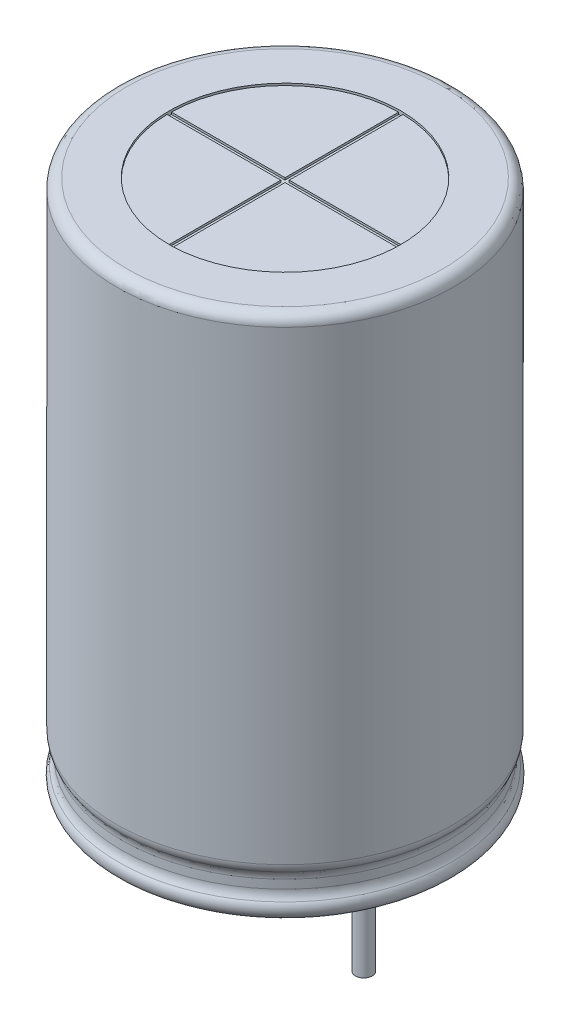
ISO-10303-21;
HEADER;
FILE_DESCRIPTION(('STEP AP214'),'2;1');
FILE_NAME('part.step','',(''),(''),'','','');
FILE_SCHEMA(('AUTOMOTIVE_DESIGN { 1 0 10303 214 1 1 1 1 }'));
ENDSEC;
DATA;
#1=APPLICATION_CONTEXT('core data for automotive mechanical design processes');
#2=APPLICATION_PROTOCOL_DEFINITION('international standard','automotive_design',2000,#1);
#3=PRODUCT_CONTEXT('',#1,'mechanical');
#4=PRODUCT('Part','Part','',(#3));
#5=PRODUCT_RELATED_PRODUCT_CATEGORY('part','',(#4));
#6=PRODUCT_DEFINITION_FORMATION('','',#4);
#7=PRODUCT_DEFINITION_CONTEXT('part definition',#1,'design');
#8=PRODUCT_DEFINITION('design','',#6,#7);
#9=PRODUCT_DEFINITION_SHAPE('','',#8);
#10=(LENGTH_UNIT() NAMED_UNIT(*) SI_UNIT(.MILLI.,.METRE.));
#11=(NAMED_UNIT(*) PLANE_ANGLE_UNIT() SI_UNIT($,.RADIAN.));
#12=(NAMED_UNIT(*) SI_UNIT($,.STERADIAN.) SOLID_ANGLE_UNIT());
#13=UNCERTAINTY_MEASURE_WITH_UNIT(LENGTH_MEASURE(1.E-05),#10,'distance_accuracy_value','');
#14=(GEOMETRIC_REPRESENTATION_CONTEXT(3) GLOBAL_UNCERTAINTY_ASSIGNED_CONTEXT((#13)) GLOBAL_UNIT_ASSIGNED_CONTEXT((#10,
#11,#12)) REPRESENTATION_CONTEXT('',''));
#15=CARTESIAN_POINT('',(0.,0.,0.));
#16=DIRECTION('',(0.,0.,1.));
#17=DIRECTION('',(1.,0.,0.));
#18=AXIS2_PLACEMENT_3D('',#15,#16,#17);
#19=CARTESIAN_POINT('',(0.,24.9,0.));
#20=DIRECTION('',(0.,-1.,0.));
#21=DIRECTION('',(0.,0.,-1.));
#22=AXIS2_PLACEMENT_3D('',#19,#20,#21);
#23=PLANE('',#22);
#24=CARTESIAN_POINT('',(0.,24.9,0.));
#25=DIRECTION('',(0.,1.,0.));
#26=DIRECTION('',(0.,0.,-1.));
#27=AXIS2_PLACEMENT_3D('',#24,#25,#26);
#28=CIRCLE('',#27,5.5);
#29=CARTESIAN_POINT('',(0.0999999999999808,24.9,5.499090833947));
#30=VERTEX_POINT('',#29);
#31=CARTESIAN_POINT('',(5.49909083394701,24.9,0.100000000000018));
#32=VERTEX_POINT('',#31);
#33=EDGE_CURVE('E145',#30,#32,#28,.T.);
#34=ORIENTED_EDGE('',*,*,#33,.T.);
#35=DIRECTION('',(1.,0.,0.));
#36=VECTOR('',#35,1.);
#37=CARTESIAN_POINT('',(0.100000000000001,24.9,0.0999999999999997));
#38=LINE('',#37,#36);
#39=CARTESIAN_POINT('',(0.100000000000001,24.9,0.0999999999999997));
#40=VERTEX_POINT('',#39);
#41=EDGE_CURVE('E179',#40,#32,#38,.T.);
#42=ORIENTED_EDGE('',*,*,#41,.F.);
#43=DIRECTION('',(0.,0.,-1.));
#44=VECTOR('',#43,1.);
#45=CARTESIAN_POINT('',(0.0999999999999823,24.9,5.499090833947));
#46=LINE('',#45,#44);
#47=EDGE_CURVE('E177',#30,#40,#46,.T.);
#48=ORIENTED_EDGE('',*,*,#47,.F.);
#49=EDGE_LOOP('',(#34,#42,#48));
#50=FACE_BOUND('',#49,.T.);
#51=ADVANCED_FACE('F35',(#50),#23,.F.);
#52=CARTESIAN_POINT('',(-5.499090833947,24.9,0.0999999999999632));
#53=VERTEX_POINT('',#52);
#54=CARTESIAN_POINT('',(-0.100000000000037,24.9,5.49909083394701));
#55=VERTEX_POINT('',#54);
#56=EDGE_CURVE('E204',#53,#55,#28,.T.);
#57=ORIENTED_EDGE('',*,*,#56,.T.);
#58=DIRECTION('',(0.,0.,1.));
#59=VECTOR('',#58,1.);
#60=CARTESIAN_POINT('',(-0.1,24.9,0.100000000000001));
#61=LINE('',#60,#59);
#62=CARTESIAN_POINT('',(-0.1,24.9,0.100000000000001));
#63=VERTEX_POINT('',#62);
#64=EDGE_CURVE('E174',#63,#55,#61,.T.);
#65=ORIENTED_EDGE('',*,*,#64,.F.);
#66=DIRECTION('',(1.,0.,0.));
#67=VECTOR('',#66,1.);
#68=CARTESIAN_POINT('',(-5.49909083394701,24.9,0.0999999999999631));
#69=LINE('',#68,#67);
#70=EDGE_CURVE('E171',#53,#63,#69,.T.);
#71=ORIENTED_EDGE('',*,*,#70,.F.);
#72=EDGE_LOOP('',(#57,#65,#71));
#73=FACE_BOUND('',#72,.T.);
#74=ADVANCED_FACE('F245',(#73),#23,.F.);
#75=CARTESIAN_POINT('',(-0.0999999999999423,24.9,-5.49909083394701));
#76=VERTEX_POINT('',#75);
#77=CARTESIAN_POINT('',(-5.49909083394701,24.9,-0.100000000000056));
#78=VERTEX_POINT('',#77);
#79=EDGE_CURVE('E200',#76,#78,#28,.T.);
#80=ORIENTED_EDGE('',*,*,#79,.T.);
#81=DIRECTION('',(-1.,0.,0.));
#82=VECTOR('',#81,1.);
#83=CARTESIAN_POINT('',(-0.1,24.9,-0.1));
#84=LINE('',#83,#82);
#85=CARTESIAN_POINT('',(-0.1,24.9,-0.1));
#86=VERTEX_POINT('',#85);
#87=EDGE_CURVE('E168',#86,#78,#84,.T.);
#88=ORIENTED_EDGE('',*,*,#87,.F.);
#89=DIRECTION('',(0.,0.,1.));
#90=VECTOR('',#89,1.);
#91=CARTESIAN_POINT('',(-0.0999999999999439,24.9,-5.49909083394701));
#92=LINE('',#91,#90);
#93=EDGE_CURVE('E165',#76,#86,#92,.T.);
#94=ORIENTED_EDGE('',*,*,#93,.F.);
#95=EDGE_LOOP('',(#80,#88,#94));
#96=FACE_BOUND('',#95,.T.);
#97=ADVANCED_FACE('F252',(#96),#23,.F.);
#98=CARTESIAN_POINT('',(0.,25.,0.));
#99=DIRECTION('',(0.,-1.,0.));
#100=DIRECTION('',(1.,0.,0.));
#101=AXIS2_PLACEMENT_3D('',#98,#99,#100);
#102=CYLINDRICAL_SURFACE('',#101,8.);
#103=CARTESIAN_POINT('',(0.,24.5,0.));
#104=DIRECTION('',(0.,1.,0.));
#105=DIRECTION('',(-1.,0.,0.));
#106=AXIS2_PLACEMENT_3D('',#103,#104,#105);
#107=CIRCLE('',#106,8.);
#108=CARTESIAN_POINT('',(-8.,24.5,0.));
#109=VERTEX_POINT('',#108);
#110=EDGE_CURVE('E219',#109,#109,#107,.F.);
#111=ORIENTED_EDGE('',*,*,#110,.T.);
#112=EDGE_LOOP('',(#111));
#113=FACE_BOUND('',#112,.T.);
#114=CARTESIAN_POINT('',(0.,2.40756880196224,0.));
#115=DIRECTION('',(0.,-1.,0.));
#116=DIRECTION('',(1.,0.,0.));
#117=AXIS2_PLACEMENT_3D('',#114,#115,#116);
#118=CIRCLE('',#117,8.);
#119=CARTESIAN_POINT('',(8.,2.40756880196224,0.));
#120=VERTEX_POINT('',#119);
#121=EDGE_CURVE('E203',#120,#120,#118,.T.);
#122=ORIENTED_EDGE('',*,*,#121,.F.);
#123=EDGE_LOOP('',(#122));
#124=FACE_BOUND('',#123,.T.);
#125=ADVANCED_FACE('F268',(#113,#124),#102,.T.);
#126=CARTESIAN_POINT('',(8.,25.,0.));
#127=DIRECTION('',(0.,1.,0.));
#128=DIRECTION('',(-1.,0.,0.));
#129=AXIS2_PLACEMENT_3D('',#126,#127,#128);
#130=PLANE('',#129);
#131=CARTESIAN_POINT('',(0.,25.,0.));
#132=DIRECTION('',(0.,1.,0.));
#133=DIRECTION('',(-1.,0.,0.));
#134=AXIS2_PLACEMENT_3D('',#131,#132,#133);
#135=CIRCLE('',#134,7.5);
#136=CARTESIAN_POINT('',(-7.5,25.,0.));
#137=VERTEX_POINT('',#136);
#138=EDGE_CURVE('E222',#137,#137,#135,.T.);
#139=ORIENTED_EDGE('',*,*,#138,.T.);
#140=EDGE_LOOP('',(#139));
#141=FACE_BOUND('',#140,.T.);
#142=CARTESIAN_POINT('',(0.,25.,0.));
#143=DIRECTION('',(0.,1.,0.));
#144=DIRECTION('',(0.,0.,-1.));
#145=AXIS2_PLACEMENT_3D('',#142,#143,#144);
#146=CIRCLE('',#145,5.5);
#147=CARTESIAN_POINT('',(0.,25.,-5.5));
#148=VERTEX_POINT('',#147);
#149=EDGE_CURVE('E182',#148,#148,#146,.T.);
#150=ORIENTED_EDGE('',*,*,#149,.F.);
#151=EDGE_LOOP('',(#150));
#152=FACE_BOUND('',#151,.T.);
#153=ADVANCED_FACE('F273',(#141,#152),#130,.T.);
#154=CARTESIAN_POINT('',(0.,0.,0.));
#155=DIRECTION('',(0.,-1.,0.));
#156=DIRECTION('',(1.,0.,0.));
#157=AXIS2_PLACEMENT_3D('',#154,#155,#156);
#158=PLANE('',#157);
#159=CARTESIAN_POINT('',(0.,0.,0.));
#160=DIRECTION('',(0.,-1.,0.));
#161=DIRECTION('',(1.,0.,0.));
#162=AXIS2_PLACEMENT_3D('',#159,#160,#161);
#163=CIRCLE('',#162,7.51793220524762);
#164=CARTESIAN_POINT('',(7.51793220524762,0.,0.));
#165=VERTEX_POINT('',#164);
#166=EDGE_CURVE('E43',#165,#165,#163,.T.);
#167=ORIENTED_EDGE('',*,*,#166,.T.);
#168=EDGE_LOOP('',(#167));
#169=FACE_BOUND('',#168,.T.);
#170=CARTESIAN_POINT('',(0.,0.,0.));
#171=DIRECTION('',(0.,-1.,0.));
#172=DIRECTION('',(1.,0.,0.));
#173=AXIS2_PLACEMENT_3D('',#170,#171,#172);
#174=CIRCLE('',#173,5.5);
#175=CARTESIAN_POINT('',(5.5,0.,0.));
#176=VERTEX_POINT('',#175);
#177=EDGE_CURVE('E370',#176,#176,#174,.T.);
#178=ORIENTED_EDGE('',*,*,#177,.F.);
#179=EDGE_LOOP('',(#178));
#180=FACE_BOUND('',#179,.T.);
#181=ADVANCED_FACE('F227',(#169,#180),#158,.T.);
#182=CARTESIAN_POINT('',(0.,1.23259900370742,0.));
#183=DIRECTION('',(0.,-1.,0.));
#184=DIRECTION('',(1.,0.,0.));
#185=AXIS2_PLACEMENT_3D('',#182,#183,#184);
#186=TOROIDAL_SURFACE('',#185,8.43125,0.670833333333331);
#187=CARTESIAN_POINT('',(0.,0.812853667063678,0.));
#188=DIRECTION('',(0.,1.,0.));
#189=DIRECTION('',(-1.,0.,0.));
#190=AXIS2_PLACEMENT_3D('',#187,#188,#189);
#191=CIRCLE('',#190,7.90796115674331);
#192=CARTESIAN_POINT('',(-7.90796115674331,0.812853667063677,0.));
#193=VERTEX_POINT('',#192);
#194=EDGE_CURVE('E11',#193,#193,#191,.T.);
#195=ORIENTED_EDGE('',*,*,#194,.T.);
#196=EDGE_LOOP('',(#195));
#197=FACE_BOUND('',#196,.T.);
#198=CARTESIAN_POINT('',(0.,1.23259900370742,0.));
#199=DIRECTION('',(0.,-1.,0.));
#200=DIRECTION('',(1.,0.,0.));
#201=AXIS2_PLACEMENT_3D('',#198,#199,#200);
#202=CIRCLE('',#201,7.76041666666666);
#203=CARTESIAN_POINT('',(7.76041666666666,1.23259900370742,0.));
#204=VERTEX_POINT('',#203);
#205=EDGE_CURVE('E216',#204,#204,#202,.T.);
#206=ORIENTED_EDGE('',*,*,#205,.T.);
#207=EDGE_LOOP('',(#206));
#208=FACE_BOUND('',#207,.T.);
#209=ADVANCED_FACE('F380',(#197,#208),#186,.F.);
#210=CARTESIAN_POINT('',(0.,25.,0.));
#211=DIRECTION('',(0.,-1.,0.));
#212=DIRECTION('',(1.,0.,0.));
#213=AXIS2_PLACEMENT_3D('',#210,#211,#212);
#214=CYLINDRICAL_SURFACE('',#213,7.76041666666666);
#215=CARTESIAN_POINT('',(0.,1.64240099629257,0.));
#216=DIRECTION('',(0.,-1.,0.));
#217=DIRECTION('',(1.,0.,0.));
#218=AXIS2_PLACEMENT_3D('',#215,#216,#217);
#219=CIRCLE('',#218,7.76041666666667);
#220=CARTESIAN_POINT('',(7.76041666666667,1.64240099629258,0.));
#221=VERTEX_POINT('',#220);
#222=EDGE_CURVE('E213',#221,#221,#219,.T.);
#223=ORIENTED_EDGE('',*,*,#222,.T.);
#224=EDGE_LOOP('',(#223));
#225=FACE_BOUND('',#224,.T.);
#226=ORIENTED_EDGE('',*,*,#205,.F.);
#227=EDGE_LOOP('',(#226));
#228=FACE_BOUND('',#227,.T.);
#229=ADVANCED_FACE('F386',(#225,#228),#214,.T.);
#230=CARTESIAN_POINT('',(0.,1.64240099629258,0.));
#231=DIRECTION('',(0.,-1.,0.));
#232=DIRECTION('',(1.,0.,0.));
#233=AXIS2_PLACEMENT_3D('',#230,#231,#232);
#234=TOROIDAL_SURFACE('',#233,8.43125,0.670833333333334);
#235=CARTESIAN_POINT('',(0.,2.02498489912741,0.));
#236=DIRECTION('',(0.,-1.,0.));
#237=DIRECTION('',(1.,0.,0.));
#238=AXIS2_PLACEMENT_3D('',#235,#236,#237);
#239=CIRCLE('',#238,7.88020833333333);
#240=CARTESIAN_POINT('',(7.88020833333333,2.02498489912741,0.));
#241=VERTEX_POINT('',#240);
#242=EDGE_CURVE('E210',#241,#241,#239,.T.);
#243=ORIENTED_EDGE('',*,*,#242,.T.);
#244=EDGE_LOOP('',(#243));
#245=FACE_BOUND('',#244,.T.);
#246=ORIENTED_EDGE('',*,*,#222,.F.);
#247=EDGE_LOOP('',(#246));
#248=FACE_BOUND('',#247,.T.);
#249=ADVANCED_FACE('F394',(#245,#248),#234,.F.);
#250=CARTESIAN_POINT('',(0.,2.40756880196224,0.));
#251=DIRECTION('',(0.,-1.,0.));
#252=DIRECTION('',(1.,0.,0.));
#253=AXIS2_PLACEMENT_3D('',#250,#251,#252);
#254=TOROIDAL_SURFACE('',#253,7.32916666666666,0.670833333333332);
#255=ORIENTED_EDGE('',*,*,#121,.T.);
#256=EDGE_LOOP('',(#255));
#257=FACE_BOUND('',#256,.T.);
#258=ORIENTED_EDGE('',*,*,#242,.F.);
#259=EDGE_LOOP('',(#258));
#260=FACE_BOUND('',#259,.T.);
#261=ADVANCED_FACE('F265',(#257,#260),#254,.T.);
#262=CARTESIAN_POINT('',(0.,24.9,0.));
#263=DIRECTION('',(0.,1.,0.));
#264=DIRECTION('',(0.,0.,1.));
#265=AXIS2_PLACEMENT_3D('',#262,#263,#264);
#266=CYLINDRICAL_SURFACE('',#265,5.5);
#267=ORIENTED_EDGE('',*,*,#79,.F.);
#268=DIRECTION('',(0.,1.,0.));
#269=VECTOR('',#268,1.);
#270=CARTESIAN_POINT('',(-0.0999999999999423,24.8,-5.49909083394701));
#271=LINE('',#270,#269);
#272=CARTESIAN_POINT('',(-0.0999999999999423,24.8,-5.49909083394701));
#273=VERTEX_POINT('',#272);
#274=EDGE_CURVE('E193',#273,#76,#271,.T.);
#275=ORIENTED_EDGE('',*,*,#274,.F.);
#276=CARTESIAN_POINT('',(0.,24.8,0.));
#277=DIRECTION('',(0.,1.,0.));
#278=DIRECTION('',(0.,0.,1.));
#279=AXIS2_PLACEMENT_3D('',#276,#277,#278);
#280=CIRCLE('',#279,5.5);
#281=CARTESIAN_POINT('',(0.0999999999999986,24.8,-5.49909083394701));
#282=VERTEX_POINT('',#281);
#283=EDGE_CURVE('E293',#282,#273,#280,.T.);
#284=ORIENTED_EDGE('',*,*,#283,.F.);
#285=DIRECTION('',(0.,1.,0.));
#286=VECTOR('',#285,1.);
#287=CARTESIAN_POINT('',(0.0999999999999986,24.8,-5.49909083394701));
#288=LINE('',#287,#286);
#289=CARTESIAN_POINT('',(0.0999999999999986,24.9,-5.49909083394701));
#290=VERTEX_POINT('',#289);
#291=EDGE_CURVE('E195',#282,#290,#288,.T.);
#292=ORIENTED_EDGE('',*,*,#291,.T.);
#293=CARTESIAN_POINT('',(5.499090833947,24.9,-0.100000000000002));
#294=VERTEX_POINT('',#293);
#295=EDGE_CURVE('E205',#294,#290,#28,.T.);
#296=ORIENTED_EDGE('',*,*,#295,.F.);
#297=DIRECTION('',(0.,1.,0.));
#298=VECTOR('',#297,1.);
#299=CARTESIAN_POINT('',(5.499090833947,24.8,-0.100000000000002));
#300=LINE('',#299,#298);
#301=CARTESIAN_POINT('',(5.499090833947,24.8,-0.100000000000002));
#302=VERTEX_POINT('',#301);
#303=EDGE_CURVE('E50',#302,#294,#300,.T.);
#304=ORIENTED_EDGE('',*,*,#303,.F.);
#305=CARTESIAN_POINT('',(0.,24.8,0.));
#306=DIRECTION('',(0.,1.,0.));
#307=DIRECTION('',(0.,0.,1.));
#308=AXIS2_PLACEMENT_3D('',#305,#306,#307);
#309=CIRCLE('',#308,5.5);
#310=CARTESIAN_POINT('',(5.49909083394701,24.8,0.100000000000018));
#311=VERTEX_POINT('',#310);
#312=EDGE_CURVE('E58',#311,#302,#309,.T.);
#313=ORIENTED_EDGE('',*,*,#312,.F.);
#314=DIRECTION('',(0.,1.,0.));
#315=VECTOR('',#314,1.);
#316=CARTESIAN_POINT('',(5.49909083394701,24.8,0.100000000000018));
#317=LINE('',#316,#315);
#318=EDGE_CURVE('E97',#311,#32,#317,.T.);
#319=ORIENTED_EDGE('',*,*,#318,.T.);
#320=ORIENTED_EDGE('',*,*,#33,.F.);
#321=DIRECTION('',(0.,1.,0.));
#322=VECTOR('',#321,1.);
#323=CARTESIAN_POINT('',(0.0999999999999808,24.8,5.499090833947));
#324=LINE('',#323,#322);
#325=CARTESIAN_POINT('',(0.0999999999999808,24.8,5.499090833947));
#326=VERTEX_POINT('',#325);
#327=EDGE_CURVE('E140',#326,#30,#324,.T.);
#328=ORIENTED_EDGE('',*,*,#327,.F.);
#329=CARTESIAN_POINT('',(0.,24.8,0.));
#330=DIRECTION('',(0.,1.,0.));
#331=DIRECTION('',(0.,0.,1.));
#332=AXIS2_PLACEMENT_3D('',#329,#330,#331);
#333=CIRCLE('',#332,5.5);
#334=CARTESIAN_POINT('',(-0.100000000000037,24.8,5.49909083394701));
#335=VERTEX_POINT('',#334);
#336=EDGE_CURVE('E130',#335,#326,#333,.T.);
#337=ORIENTED_EDGE('',*,*,#336,.F.);
#338=DIRECTION('',(0.,1.,0.));
#339=VECTOR('',#338,1.);
#340=CARTESIAN_POINT('',(-0.100000000000037,24.8,5.49909083394701));
#341=LINE('',#340,#339);
#342=EDGE_CURVE('E150',#335,#55,#341,.T.);
#343=ORIENTED_EDGE('',*,*,#342,.T.);
#344=ORIENTED_EDGE('',*,*,#56,.F.);
#345=DIRECTION('',(0.,1.,0.));
#346=VECTOR('',#345,1.);
#347=CARTESIAN_POINT('',(-5.499090833947,24.8,0.0999999999999632));
#348=LINE('',#347,#346);
#349=CARTESIAN_POINT('',(-5.499090833947,24.8,0.0999999999999632));
#350=VERTEX_POINT('',#349);
#351=EDGE_CURVE('E187',#350,#53,#348,.T.);
#352=ORIENTED_EDGE('',*,*,#351,.F.);
#353=CARTESIAN_POINT('',(0.,24.8,0.));
#354=DIRECTION('',(0.,1.,0.));
#355=DIRECTION('',(0.,0.,1.));
#356=AXIS2_PLACEMENT_3D('',#353,#354,#355);
#357=CIRCLE('',#356,5.49999999999999);
#358=CARTESIAN_POINT('',(-5.49909083394701,24.8,-0.100000000000056));
#359=VERTEX_POINT('',#358);
#360=EDGE_CURVE('E283',#359,#350,#357,.T.);
#361=ORIENTED_EDGE('',*,*,#360,.F.);
#362=DIRECTION('',(0.,1.,0.));
#363=VECTOR('',#362,1.);
#364=CARTESIAN_POINT('',(-5.49909083394701,24.8,-0.100000000000056));
#365=LINE('',#364,#363);
#366=EDGE_CURVE('E189',#359,#78,#365,.T.);
#367=ORIENTED_EDGE('',*,*,#366,.T.);
#368=EDGE_LOOP('',(#267,#275,#284,#292,#296,#304,#313,#319,#320,#328,#337,#343,#344,#352,#361,#367));
#369=FACE_BOUND('',#368,.T.);
#370=ORIENTED_EDGE('',*,*,#149,.T.);
#371=EDGE_LOOP('',(#370));
#372=FACE_BOUND('',#371,.T.);
#373=ADVANCED_FACE('F142',(#369,#372),#266,.F.);
#374=ORIENTED_EDGE('',*,*,#295,.T.);
#375=DIRECTION('',(0.,0.,-1.));
#376=VECTOR('',#375,1.);
#377=CARTESIAN_POINT('',(0.0999999999999994,24.9,-0.100000000000002));
#378=LINE('',#377,#376);
#379=CARTESIAN_POINT('',(0.0999999999999994,24.9,-0.100000000000002));
#380=VERTEX_POINT('',#379);
#381=EDGE_CURVE('E161',#380,#290,#378,.T.);
#382=ORIENTED_EDGE('',*,*,#381,.F.);
#383=DIRECTION('',(-1.,0.,0.));
#384=VECTOR('',#383,1.);
#385=CARTESIAN_POINT('',(5.499090833947,24.9,-0.100000000000002));
#386=LINE('',#385,#384);
#387=EDGE_CURVE('E159',#294,#380,#386,.T.);
#388=ORIENTED_EDGE('',*,*,#387,.F.);
#389=EDGE_LOOP('',(#374,#382,#388));
#390=FACE_BOUND('',#389,.T.);
#391=ADVANCED_FACE('F248',(#390),#23,.F.);
#392=CARTESIAN_POINT('',(0.100000000000001,24.8,0.0999999999999997));
#393=DIRECTION('',(0.,0.,1.));
#394=DIRECTION('',(1.,0.,0.));
#395=AXIS2_PLACEMENT_3D('',#392,#393,#394);
#396=PLANE('',#395);
#397=ORIENTED_EDGE('',*,*,#41,.T.);
#398=ORIENTED_EDGE('',*,*,#318,.F.);
#399=DIRECTION('',(1.,0.,0.));
#400=VECTOR('',#399,1.);
#401=CARTESIAN_POINT('',(0.100000000000001,24.8,0.0999999999999997));
#402=LINE('',#401,#400);
#403=CARTESIAN_POINT('',(0.100000000000001,24.8,0.0999999999999997));
#404=VERTEX_POINT('',#403);
#405=EDGE_CURVE('E154',#404,#311,#402,.T.);
#406=ORIENTED_EDGE('',*,*,#405,.F.);
#407=DIRECTION('',(0.,1.,0.));
#408=VECTOR('',#407,1.);
#409=CARTESIAN_POINT('',(0.100000000000001,24.8,0.0999999999999997));
#410=LINE('',#409,#408);
#411=EDGE_CURVE('E149',#404,#40,#410,.T.);
#412=ORIENTED_EDGE('',*,*,#411,.T.);
#413=EDGE_LOOP('',(#397,#398,#406,#412));
#414=FACE_BOUND('',#413,.T.);
#415=ADVANCED_FACE('F257',(#414),#396,.F.);
#416=CARTESIAN_POINT('',(0.0999999999999823,24.8,5.499090833947));
#417=DIRECTION('',(1.,0.,0.));
#418=DIRECTION('',(0.,0.,-1.));
#419=AXIS2_PLACEMENT_3D('',#416,#417,#418);
#420=PLANE('',#419);
#421=ORIENTED_EDGE('',*,*,#47,.T.);
#422=ORIENTED_EDGE('',*,*,#411,.F.);
#423=DIRECTION('',(0.,0.,-1.));
#424=VECTOR('',#423,1.);
#425=CARTESIAN_POINT('',(0.0999999999999823,24.8,5.499090833947));
#426=LINE('',#425,#424);
#427=EDGE_CURVE('E135',#326,#404,#426,.T.);
#428=ORIENTED_EDGE('',*,*,#427,.F.);
#429=ORIENTED_EDGE('',*,*,#327,.T.);
#430=EDGE_LOOP('',(#421,#422,#428,#429));
#431=FACE_BOUND('',#430,.T.);
#432=ADVANCED_FACE('F152',(#431),#420,.F.);
#433=CARTESIAN_POINT('',(-0.1,24.8,0.100000000000001));
#434=DIRECTION('',(-1.,0.,0.));
#435=DIRECTION('',(0.,0.,1.));
#436=AXIS2_PLACEMENT_3D('',#433,#434,#435);
#437=PLANE('',#436);
#438=ORIENTED_EDGE('',*,*,#64,.T.);
#439=ORIENTED_EDGE('',*,*,#342,.F.);
#440=DIRECTION('',(0.,0.,1.));
#441=VECTOR('',#440,1.);
#442=CARTESIAN_POINT('',(-0.1,24.8,0.100000000000001));
#443=LINE('',#442,#441);
#444=CARTESIAN_POINT('',(-0.1,24.8,0.100000000000001));
#445=VERTEX_POINT('',#444);
#446=EDGE_CURVE('E138',#445,#335,#443,.T.);
#447=ORIENTED_EDGE('',*,*,#446,.F.);
#448=DIRECTION('',(0.,1.,0.));
#449=VECTOR('',#448,1.);
#450=CARTESIAN_POINT('',(-0.1,24.8,0.100000000000001));
#451=LINE('',#450,#449);
#452=EDGE_CURVE('E185',#445,#63,#451,.T.);
#453=ORIENTED_EDGE('',*,*,#452,.T.);
#454=EDGE_LOOP('',(#438,#439,#447,#453));
#455=FACE_BOUND('',#454,.T.);
#456=ADVANCED_FACE('F308',(#455),#437,.F.);
#457=CARTESIAN_POINT('',(-5.49909083394701,24.8,0.0999999999999631));
#458=DIRECTION('',(0.,0.,1.));
#459=DIRECTION('',(1.,0.,0.));
#460=AXIS2_PLACEMENT_3D('',#457,#458,#459);
#461=PLANE('',#460);
#462=ORIENTED_EDGE('',*,*,#70,.T.);
#463=ORIENTED_EDGE('',*,*,#452,.F.);
#464=DIRECTION('',(1.,0.,0.));
#465=VECTOR('',#464,1.);
#466=CARTESIAN_POINT('',(-5.49909083394701,24.8,0.0999999999999631));
#467=LINE('',#466,#465);
#468=EDGE_CURVE('E301',#350,#445,#467,.T.);
#469=ORIENTED_EDGE('',*,*,#468,.F.);
#470=ORIENTED_EDGE('',*,*,#351,.T.);
#471=EDGE_LOOP('',(#462,#463,#469,#470));
#472=FACE_BOUND('',#471,.T.);
#473=ADVANCED_FACE('F304',(#472),#461,.F.);
#474=CARTESIAN_POINT('',(-0.1,24.8,-0.1));
#475=DIRECTION('',(0.,0.,-1.));
#476=DIRECTION('',(-1.,0.,0.));
#477=AXIS2_PLACEMENT_3D('',#474,#475,#476);
#478=PLANE('',#477);
#479=ORIENTED_EDGE('',*,*,#87,.T.);
#480=ORIENTED_EDGE('',*,*,#366,.F.);
#481=DIRECTION('',(-1.,0.,0.));
#482=VECTOR('',#481,1.);
#483=CARTESIAN_POINT('',(-0.1,24.8,-0.1));
#484=LINE('',#483,#482);
#485=CARTESIAN_POINT('',(-0.1,24.8,-0.1));
#486=VERTEX_POINT('',#485);
#487=EDGE_CURVE('E288',#486,#359,#484,.T.);
#488=ORIENTED_EDGE('',*,*,#487,.F.);
#489=DIRECTION('',(0.,1.,0.));
#490=VECTOR('',#489,1.);
#491=CARTESIAN_POINT('',(-0.1,24.8,-0.1));
#492=LINE('',#491,#490);
#493=EDGE_CURVE('E191',#486,#86,#492,.T.);
#494=ORIENTED_EDGE('',*,*,#493,.T.);
#495=EDGE_LOOP('',(#479,#480,#488,#494));
#496=FACE_BOUND('',#495,.T.);
#497=ADVANCED_FACE('F287',(#496),#478,.F.);
#498=CARTESIAN_POINT('',(-0.0999999999999439,24.8,-5.49909083394701));
#499=DIRECTION('',(-1.,0.,0.));
#500=DIRECTION('',(0.,0.,1.));
#501=AXIS2_PLACEMENT_3D('',#498,#499,#500);
#502=PLANE('',#501);
#503=ORIENTED_EDGE('',*,*,#93,.T.);
#504=ORIENTED_EDGE('',*,*,#493,.F.);
#505=DIRECTION('',(0.,0.,1.));
#506=VECTOR('',#505,1.);
#507=CARTESIAN_POINT('',(-0.0999999999999439,24.8,-5.49909083394701));
#508=LINE('',#507,#506);
#509=EDGE_CURVE('E292',#273,#486,#508,.T.);
#510=ORIENTED_EDGE('',*,*,#509,.F.);
#511=ORIENTED_EDGE('',*,*,#274,.T.);
#512=EDGE_LOOP('',(#503,#504,#510,#511));
#513=FACE_BOUND('',#512,.T.);
#514=ADVANCED_FACE('F291',(#513),#502,.F.);
#515=CARTESIAN_POINT('',(0.0999999999999994,24.8,-0.100000000000002));
#516=DIRECTION('',(1.,0.,0.));
#517=DIRECTION('',(0.,0.,-1.));
#518=AXIS2_PLACEMENT_3D('',#515,#516,#517);
#519=PLANE('',#518);
#520=ORIENTED_EDGE('',*,*,#381,.T.);
#521=ORIENTED_EDGE('',*,*,#291,.F.);
#522=DIRECTION('',(0.,0.,-1.));
#523=VECTOR('',#522,1.);
#524=CARTESIAN_POINT('',(0.0999999999999994,24.8,-0.100000000000002));
#525=LINE('',#524,#523);
#526=CARTESIAN_POINT('',(0.0999999999999994,24.8,-0.100000000000002));
#527=VERTEX_POINT('',#526);
#528=EDGE_CURVE('E296',#527,#282,#525,.T.);
#529=ORIENTED_EDGE('',*,*,#528,.F.);
#530=DIRECTION('',(0.,1.,0.));
#531=VECTOR('',#530,1.);
#532=CARTESIAN_POINT('',(0.0999999999999994,24.8,-0.100000000000002));
#533=LINE('',#532,#531);
#534=EDGE_CURVE('E197',#527,#380,#533,.T.);
#535=ORIENTED_EDGE('',*,*,#534,.T.);
#536=EDGE_LOOP('',(#520,#521,#529,#535));
#537=FACE_BOUND('',#536,.T.);
#538=ADVANCED_FACE('F316',(#537),#519,.F.);
#539=CARTESIAN_POINT('',(5.499090833947,24.8,-0.100000000000002));
#540=DIRECTION('',(0.,0.,-1.));
#541=DIRECTION('',(-1.,0.,0.));
#542=AXIS2_PLACEMENT_3D('',#539,#540,#541);
#543=PLANE('',#542);
#544=ORIENTED_EDGE('',*,*,#387,.T.);
#545=ORIENTED_EDGE('',*,*,#534,.F.);
#546=DIRECTION('',(-1.,0.,0.));
#547=VECTOR('',#546,1.);
#548=CARTESIAN_POINT('',(5.499090833947,24.8,-0.100000000000002));
#549=LINE('',#548,#547);
#550=EDGE_CURVE('E376',#302,#527,#549,.T.);
#551=ORIENTED_EDGE('',*,*,#550,.F.);
#552=ORIENTED_EDGE('',*,*,#303,.T.);
#553=EDGE_LOOP('',(#544,#545,#551,#552));
#554=FACE_BOUND('',#553,.T.);
#555=ADVANCED_FACE('F318',(#554),#543,.F.);
#556=CARTESIAN_POINT('',(0.,24.8,0.));
#557=DIRECTION('',(0.,1.,0.));
#558=DIRECTION('',(0.,0.,1.));
#559=AXIS2_PLACEMENT_3D('',#556,#557,#558);
#560=PLANE('',#559);
#561=ORIENTED_EDGE('',*,*,#312,.T.);
#562=ORIENTED_EDGE('',*,*,#550,.T.);
#563=ORIENTED_EDGE('',*,*,#528,.T.);
#564=ORIENTED_EDGE('',*,*,#283,.T.);
#565=ORIENTED_EDGE('',*,*,#509,.T.);
#566=ORIENTED_EDGE('',*,*,#487,.T.);
#567=ORIENTED_EDGE('',*,*,#360,.T.);
#568=ORIENTED_EDGE('',*,*,#468,.T.);
#569=ORIENTED_EDGE('',*,*,#446,.T.);
#570=ORIENTED_EDGE('',*,*,#336,.T.);
#571=ORIENTED_EDGE('',*,*,#427,.T.);
#572=ORIENTED_EDGE('',*,*,#405,.T.);
#573=EDGE_LOOP('',(#561,#562,#563,#564,#565,#566,#567,#568,#569,#570,#571,#572));
#574=FACE_BOUND('',#573,.T.);
#575=ADVANCED_FACE('F132',(#574),#560,.T.);
#576=CARTESIAN_POINT('',(0.,0.25,0.));
#577=DIRECTION('',(0.,-1.,0.));
#578=DIRECTION('',(1.,0.,0.));
#579=AXIS2_PLACEMENT_3D('',#576,#577,#578);
#580=CYLINDRICAL_SURFACE('',#579,5.5);
#581=CARTESIAN_POINT('',(0.,0.25,0.));
#582=DIRECTION('',(0.,-1.,0.));
#583=DIRECTION('',(1.,0.,0.));
#584=AXIS2_PLACEMENT_3D('',#581,#582,#583);
#585=CIRCLE('',#584,5.5);
#586=CARTESIAN_POINT('',(5.5,0.250000000000001,0.));
#587=VERTEX_POINT('',#586);
#588=EDGE_CURVE('E162',#587,#587,#585,.T.);
#589=ORIENTED_EDGE('',*,*,#588,.F.);
#590=EDGE_LOOP('',(#589));
#591=FACE_BOUND('',#590,.T.);
#592=ORIENTED_EDGE('',*,*,#177,.T.);
#593=EDGE_LOOP('',(#592));
#594=FACE_BOUND('',#593,.T.);
#595=ADVANCED_FACE('F324',(#591,#594),#580,.F.);
#596=CARTESIAN_POINT('',(0.,0.25,0.));
#597=DIRECTION('',(0.,-1.,0.));
#598=DIRECTION('',(1.,0.,0.));
#599=AXIS2_PLACEMENT_3D('',#596,#597,#598);
#600=PLANE('',#599);
#601=CARTESIAN_POINT('',(-3.74165738677394,0.25,0.));
#602=DIRECTION('',(0.,1.,0.));
#603=DIRECTION('',(0.,0.,-1.));
#604=AXIS2_PLACEMENT_3D('',#601,#602,#603);
#605=CIRCLE('',#604,0.400000000000001);
#606=CARTESIAN_POINT('',(-3.74165738677394,0.25,-0.400000000000001));
#607=VERTEX_POINT('',#606);
#608=EDGE_CURVE('E360',#607,#607,#605,.T.);
#609=ORIENTED_EDGE('',*,*,#608,.T.);
#610=EDGE_LOOP('',(#609));
#611=FACE_BOUND('',#610,.T.);
#612=CARTESIAN_POINT('',(3.74165738677394,0.25,0.));
#613=DIRECTION('',(0.,-1.,0.));
#614=DIRECTION('',(0.,0.,-1.));
#615=AXIS2_PLACEMENT_3D('',#612,#613,#614);
#616=CIRCLE('',#615,0.400000000000001);
#617=CARTESIAN_POINT('',(3.74165738677394,0.25,-0.400000000000001));
#618=VERTEX_POINT('',#617);
#619=EDGE_CURVE('E359',#618,#618,#616,.T.);
#620=ORIENTED_EDGE('',*,*,#619,.F.);
#621=EDGE_LOOP('',(#620));
#622=FACE_BOUND('',#621,.T.);
#623=ORIENTED_EDGE('',*,*,#588,.T.);
#624=EDGE_LOOP('',(#623));
#625=FACE_BOUND('',#624,.T.);
#626=ADVANCED_FACE('F241',(#611,#622,#625),#600,.T.);
#627=CARTESIAN_POINT('',(0.,24.5,0.));
#628=DIRECTION('',(0.,1.,0.));
#629=DIRECTION('',(-1.,0.,0.));
#630=AXIS2_PLACEMENT_3D('',#627,#628,#629);
#631=TOROIDAL_SURFACE('',#630,7.5,0.5);
#632=ORIENTED_EDGE('',*,*,#138,.F.);
#633=EDGE_LOOP('',(#632));
#634=FACE_BOUND('',#633,.T.);
#635=ORIENTED_EDGE('',*,*,#110,.F.);
#636=EDGE_LOOP('',(#635));
#637=FACE_BOUND('',#636,.T.);
#638=ADVANCED_FACE('F232',(#634,#637),#631,.T.);
#639=CARTESIAN_POINT('',(0.,0.499999999999999,0.));
#640=DIRECTION('',(0.,1.,0.));
#641=DIRECTION('',(-1.,0.,0.));
#642=AXIS2_PLACEMENT_3D('',#639,#640,#641);
#643=TOROIDAL_SURFACE('',#642,7.51793220524762,0.5);
#644=ORIENTED_EDGE('',*,*,#194,.F.);
#645=EDGE_LOOP('',(#644));
#646=FACE_BOUND('',#645,.T.);
#647=ORIENTED_EDGE('',*,*,#166,.F.);
#648=EDGE_LOOP('',(#647));
#649=FACE_BOUND('',#648,.T.);
#650=ADVANCED_FACE('F37',(#646,#649),#643,.T.);
#651=CARTESIAN_POINT('',(3.74165738677394,-5.75,0.));
#652=DIRECTION('',(0.,-1.,0.));
#653=DIRECTION('',(0.,0.,-1.));
#654=AXIS2_PLACEMENT_3D('',#651,#652,#653);
#655=CYLINDRICAL_SURFACE('',#654,0.400000000000001);
#656=CARTESIAN_POINT('',(3.74165738677394,-5.75,0.));
#657=DIRECTION('',(0.,-1.,0.));
#658=DIRECTION('',(0.,0.,-1.));
#659=AXIS2_PLACEMENT_3D('',#656,#657,#658);
#660=CIRCLE('',#659,0.4);
#661=CARTESIAN_POINT('',(3.74165738677394,-5.75,-0.4));
#662=VERTEX_POINT('',#661);
#663=EDGE_CURVE('E363',#662,#662,#660,.T.);
#664=ORIENTED_EDGE('',*,*,#663,.F.);
#665=EDGE_LOOP('',(#664));
#666=FACE_BOUND('',#665,.T.);
#667=ORIENTED_EDGE('',*,*,#619,.T.);
#668=EDGE_LOOP('',(#667));
#669=FACE_BOUND('',#668,.T.);
#670=ADVANCED_FACE('F231',(#666,#669),#655,.T.);
#671=CARTESIAN_POINT('',(4.14165738677394,-5.75,0.));
#672=DIRECTION('',(0.,1.,0.));
#673=DIRECTION('',(0.,0.,1.));
#674=AXIS2_PLACEMENT_3D('',#671,#672,#673);
#675=PLANE('',#674);
#676=ORIENTED_EDGE('',*,*,#663,.T.);
#677=EDGE_LOOP('',(#676));
#678=FACE_BOUND('',#677,.T.);
#679=ADVANCED_FACE('F238',(#678),#675,.F.);
#680=CARTESIAN_POINT('',(-3.74165738677394,-5.75,0.));
#681=DIRECTION('',(0.,-1.,0.));
#682=DIRECTION('',(0.,0.,-1.));
#683=AXIS2_PLACEMENT_3D('',#680,#681,#682);
#684=CYLINDRICAL_SURFACE('',#683,0.400000000000001);
#685=CARTESIAN_POINT('',(-3.74165738677394,-5.75,0.));
#686=DIRECTION('',(0.,1.,0.));
#687=DIRECTION('',(0.,0.,-1.));
#688=AXIS2_PLACEMENT_3D('',#685,#686,#687);
#689=CIRCLE('',#688,0.4);
#690=CARTESIAN_POINT('',(-3.74165738677394,-5.75,-0.4));
#691=VERTEX_POINT('',#690);
#692=EDGE_CURVE('E358',#691,#691,#689,.T.);
#693=ORIENTED_EDGE('',*,*,#692,.T.);
#694=EDGE_LOOP('',(#693));
#695=FACE_BOUND('',#694,.T.);
#696=ORIENTED_EDGE('',*,*,#608,.F.);
#697=EDGE_LOOP('',(#696));
#698=FACE_BOUND('',#697,.T.);
#699=ADVANCED_FACE('F346',(#695,#698),#684,.T.);
#700=CARTESIAN_POINT('',(-4.14165738677394,-5.75,0.));
#701=DIRECTION('',(0.,1.,0.));
#702=DIRECTION('',(0.,0.,1.));
#703=AXIS2_PLACEMENT_3D('',#700,#701,#702);
#704=PLANE('',#703);
#705=ORIENTED_EDGE('',*,*,#692,.F.);
#706=EDGE_LOOP('',(#705));
#707=FACE_BOUND('',#706,.T.);
#708=ADVANCED_FACE('F350',(#707),#704,.F.);
#709=CLOSED_SHELL('',(#51,#74,#97,#125,#153,#181,#209,#229,#249,#261,#373,#391,#415,#432,#456,
#473,#497,#514,#538,#555,#575,#595,#626,#638,#650,#670,#679,#699,#708));
#710=MANIFOLD_SOLID_BREP('B2',#709);
#711=ADVANCED_BREP_SHAPE_REPRESENTATION('',(#18,#710),#14);
#712=SHAPE_DEFINITION_REPRESENTATION(#9,#711);
ENDSEC;
END-ISO-10303-21;
